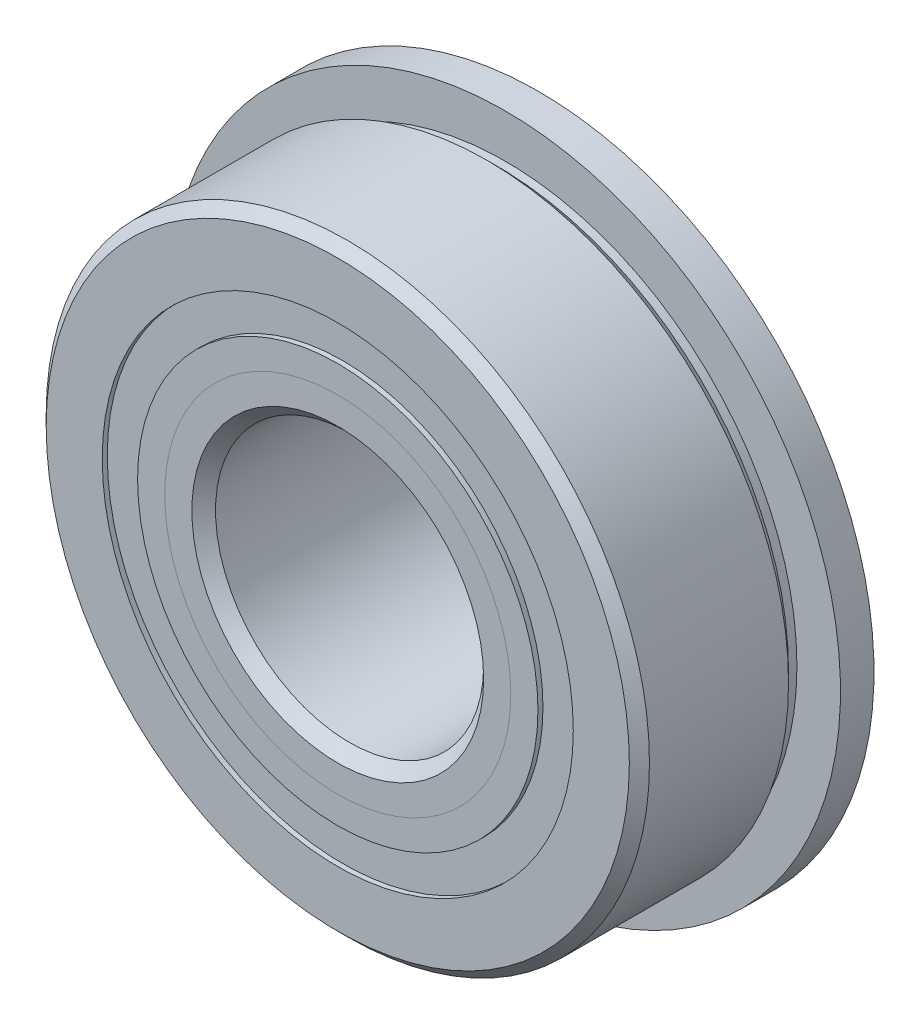
ISO-10303-21;
HEADER;
FILE_DESCRIPTION(('STEP AP214'),'2;1');
FILE_NAME('part.step','',(''),(''),'','','');
FILE_SCHEMA(('AUTOMOTIVE_DESIGN { 1 0 10303 214 1 1 1 1 }'));
ENDSEC;
DATA;
#1=APPLICATION_CONTEXT('core data for automotive mechanical design processes');
#2=APPLICATION_PROTOCOL_DEFINITION('international standard','automotive_design',2000,#1);
#3=PRODUCT_CONTEXT('',#1,'mechanical');
#4=PRODUCT('Part','Part','',(#3));
#5=PRODUCT_RELATED_PRODUCT_CATEGORY('part','',(#4));
#6=PRODUCT_DEFINITION_FORMATION('','',#4);
#7=PRODUCT_DEFINITION_CONTEXT('part definition',#1,'design');
#8=PRODUCT_DEFINITION('design','',#6,#7);
#9=PRODUCT_DEFINITION_SHAPE('','',#8);
#10=(LENGTH_UNIT() NAMED_UNIT(*) SI_UNIT(.MILLI.,.METRE.));
#11=(NAMED_UNIT(*) PLANE_ANGLE_UNIT() SI_UNIT($,.RADIAN.));
#12=(NAMED_UNIT(*) SI_UNIT($,.STERADIAN.) SOLID_ANGLE_UNIT());
#13=UNCERTAINTY_MEASURE_WITH_UNIT(LENGTH_MEASURE(1.E-05),#10,'distance_accuracy_value','');
#14=(GEOMETRIC_REPRESENTATION_CONTEXT(3) GLOBAL_UNCERTAINTY_ASSIGNED_CONTEXT((#13)) GLOBAL_UNIT_ASSIGNED_CONTEXT((#10,
#11,#12)) REPRESENTATION_CONTEXT('',''));
#15=CARTESIAN_POINT('',(0.,0.,0.));
#16=DIRECTION('',(0.,0.,1.));
#17=DIRECTION('',(1.,0.,0.));
#18=AXIS2_PLACEMENT_3D('',#15,#16,#17);
#19=CARTESIAN_POINT('',(0.,11.1561126373626,-4.524375));
#20=DIRECTION('',(0.,0.,1.));
#21=DIRECTION('',(1.,0.,0.));
#22=AXIS2_PLACEMENT_3D('',#19,#20,#21);
#23=PLANE('',#22);
#24=CARTESIAN_POINT('',(0.,0.,-4.524375));
#25=DIRECTION('',(0.,0.,1.));
#26=DIRECTION('',(1.,0.,0.));
#27=AXIS2_PLACEMENT_3D('',#24,#25,#26);
#28=CIRCLE('',#27,11.1561126373626);
#29=CARTESIAN_POINT('',(11.1561126373626,0.,-4.524375));
#30=VERTEX_POINT('',#29);
#31=EDGE_CURVE('E62',#30,#30,#28,.T.);
#32=ORIENTED_EDGE('',*,*,#31,.F.);
#33=EDGE_LOOP('',(#32));
#34=FACE_BOUND('',#33,.T.);
#35=CARTESIAN_POINT('',(0.,0.,-4.524375));
#36=DIRECTION('',(0.,0.,1.));
#37=DIRECTION('',(1.,0.,0.));
#38=AXIS2_PLACEMENT_3D('',#35,#36,#37);
#39=CIRCLE('',#38,8.7376);
#40=CARTESIAN_POINT('',(8.7376,0.,-4.524375));
#41=VERTEX_POINT('',#40);
#42=EDGE_CURVE('E11',#41,#41,#39,.T.);
#43=ORIENTED_EDGE('',*,*,#42,.T.);
#44=EDGE_LOOP('',(#43));
#45=FACE_BOUND('',#44,.T.);
#46=ADVANCED_FACE('F48',(#34,#45),#23,.F.);
#47=CARTESIAN_POINT('',(0.,0.,4.7625));
#48=DIRECTION('',(0.,0.,1.));
#49=DIRECTION('',(1.,0.,0.));
#50=AXIS2_PLACEMENT_3D('',#47,#48,#49);
#51=CYLINDRICAL_SURFACE('',#50,8.7376);
#52=ORIENTED_EDGE('',*,*,#42,.F.);
#53=EDGE_LOOP('',(#52));
#54=FACE_BOUND('',#53,.T.);
#55=CARTESIAN_POINT('',(0.,0.,-2.84734080430121));
#56=DIRECTION('',(0.,0.,1.));
#57=DIRECTION('',(1.,0.,0.));
#58=AXIS2_PLACEMENT_3D('',#55,#56,#57);
#59=CIRCLE('',#58,8.7376);
#60=CARTESIAN_POINT('',(8.7376,0.,-2.84734080430121));
#61=VERTEX_POINT('',#60);
#62=EDGE_CURVE('E54',#61,#61,#59,.T.);
#63=ORIENTED_EDGE('',*,*,#62,.T.);
#64=EDGE_LOOP('',(#63));
#65=FACE_BOUND('',#64,.T.);
#66=ADVANCED_FACE('F71',(#54,#65),#51,.F.);
#67=CARTESIAN_POINT('',(0.,11.1561126373626,-2.84734080430121));
#68=DIRECTION('',(0.,0.,-1.));
#69=DIRECTION('',(-1.,0.,0.));
#70=AXIS2_PLACEMENT_3D('',#67,#68,#69);
#71=PLANE('',#70);
#72=ORIENTED_EDGE('',*,*,#62,.F.);
#73=EDGE_LOOP('',(#72));
#74=FACE_BOUND('',#73,.T.);
#75=CARTESIAN_POINT('',(0.,0.,-2.84734080430121));
#76=DIRECTION('',(0.,0.,1.));
#77=DIRECTION('',(1.,0.,0.));
#78=AXIS2_PLACEMENT_3D('',#75,#76,#77);
#79=CIRCLE('',#78,11.1561126373626);
#80=CARTESIAN_POINT('',(11.1561126373626,0.,-2.84734080430121));
#81=VERTEX_POINT('',#80);
#82=EDGE_CURVE('E58',#81,#81,#79,.T.);
#83=ORIENTED_EDGE('',*,*,#82,.T.);
#84=EDGE_LOOP('',(#83));
#85=FACE_BOUND('',#84,.T.);
#86=ADVANCED_FACE('F75',(#74,#85),#71,.F.);
#87=CARTESIAN_POINT('',(0.,0.,4.7625));
#88=DIRECTION('',(0.,0.,1.));
#89=DIRECTION('',(1.,0.,0.));
#90=AXIS2_PLACEMENT_3D('',#87,#88,#89);
#91=CYLINDRICAL_SURFACE('',#90,11.1561126373626);
#92=ORIENTED_EDGE('',*,*,#82,.F.);
#93=EDGE_LOOP('',(#92));
#94=FACE_BOUND('',#93,.T.);
#95=ORIENTED_EDGE('',*,*,#31,.T.);
#96=EDGE_LOOP('',(#95));
#97=FACE_BOUND('',#96,.T.);
#98=ADVANCED_FACE('F68',(#94,#97),#91,.T.);
#99=CLOSED_SHELL('',(#46,#66,#86,#98));
#100=MANIFOLD_SOLID_BREP('B2',#99);
#101=CARTESIAN_POINT('',(0.,11.1561126373626,4.524375));
#102=DIRECTION('',(0.,0.,-1.));
#103=DIRECTION('',(-1.,0.,0.));
#104=AXIS2_PLACEMENT_3D('',#101,#102,#103);
#105=PLANE('',#104);
#106=CARTESIAN_POINT('',(0.,0.,4.524375));
#107=DIRECTION('',(0.,0.,1.));
#108=DIRECTION('',(1.,0.,0.));
#109=AXIS2_PLACEMENT_3D('',#106,#107,#108);
#110=CIRCLE('',#109,9.48138736263736);
#111=CARTESIAN_POINT('',(9.48138736263736,0.,4.524375));
#112=VERTEX_POINT('',#111);
#113=EDGE_CURVE('E47',#112,#112,#110,.T.);
#114=ORIENTED_EDGE('',*,*,#113,.F.);
#115=EDGE_LOOP('',(#114));
#116=FACE_BOUND('',#115,.T.);
#117=CARTESIAN_POINT('',(0.,0.,4.524375));
#118=DIRECTION('',(0.,0.,1.));
#119=DIRECTION('',(1.,0.,0.));
#120=AXIS2_PLACEMENT_3D('',#117,#118,#119);
#121=CIRCLE('',#120,11.1561126373626);
#122=CARTESIAN_POINT('',(11.1561126373626,0.,4.524375));
#123=VERTEX_POINT('',#122);
#124=EDGE_CURVE('E122',#123,#123,#121,.T.);
#125=ORIENTED_EDGE('',*,*,#124,.T.);
#126=EDGE_LOOP('',(#125));
#127=FACE_BOUND('',#126,.T.);
#128=ADVANCED_FACE('F108',(#116,#127),#105,.F.);
#129=CARTESIAN_POINT('',(0.,0.,4.7625));
#130=DIRECTION('',(0.,0.,1.));
#131=DIRECTION('',(1.,0.,0.));
#132=AXIS2_PLACEMENT_3D('',#129,#130,#131);
#133=CYLINDRICAL_SURFACE('',#132,9.48138736263736);
#134=CARTESIAN_POINT('',(0.,0.,2.84734080430121));
#135=DIRECTION('',(0.,0.,1.));
#136=DIRECTION('',(1.,0.,0.));
#137=AXIS2_PLACEMENT_3D('',#134,#135,#136);
#138=CIRCLE('',#137,9.48138736263736);
#139=CARTESIAN_POINT('',(9.48138736263736,0.,2.84734080430121));
#140=VERTEX_POINT('',#139);
#141=EDGE_CURVE('E114',#140,#140,#138,.T.);
#142=ORIENTED_EDGE('',*,*,#141,.F.);
#143=EDGE_LOOP('',(#142));
#144=FACE_BOUND('',#143,.T.);
#145=ORIENTED_EDGE('',*,*,#113,.T.);
#146=EDGE_LOOP('',(#145));
#147=FACE_BOUND('',#146,.T.);
#148=ADVANCED_FACE('F137',(#144,#147),#133,.F.);
#149=CARTESIAN_POINT('',(0.,11.1561126373626,2.84734080430121));
#150=DIRECTION('',(0.,0.,1.));
#151=DIRECTION('',(1.,0.,0.));
#152=AXIS2_PLACEMENT_3D('',#149,#150,#151);
#153=PLANE('',#152);
#154=CARTESIAN_POINT('',(0.,0.,2.84734080430121));
#155=DIRECTION('',(0.,0.,1.));
#156=DIRECTION('',(1.,0.,0.));
#157=AXIS2_PLACEMENT_3D('',#154,#155,#156);
#158=CIRCLE('',#157,11.1561126373626);
#159=CARTESIAN_POINT('',(11.1561126373626,0.,2.84734080430121));
#160=VERTEX_POINT('',#159);
#161=EDGE_CURVE('E118',#160,#160,#158,.T.);
#162=ORIENTED_EDGE('',*,*,#161,.F.);
#163=EDGE_LOOP('',(#162));
#164=FACE_BOUND('',#163,.T.);
#165=ORIENTED_EDGE('',*,*,#141,.T.);
#166=EDGE_LOOP('',(#165));
#167=FACE_BOUND('',#166,.T.);
#168=ADVANCED_FACE('F132',(#164,#167),#153,.F.);
#169=CARTESIAN_POINT('',(0.,0.,4.7625));
#170=DIRECTION('',(0.,0.,1.));
#171=DIRECTION('',(1.,0.,0.));
#172=AXIS2_PLACEMENT_3D('',#169,#170,#171);
#173=CYLINDRICAL_SURFACE('',#172,11.1561126373626);
#174=ORIENTED_EDGE('',*,*,#124,.F.);
#175=EDGE_LOOP('',(#174));
#176=FACE_BOUND('',#175,.T.);
#177=ORIENTED_EDGE('',*,*,#161,.T.);
#178=EDGE_LOOP('',(#177));
#179=FACE_BOUND('',#178,.T.);
#180=ADVANCED_FACE('F129',(#176,#179),#173,.T.);
#181=CLOSED_SHELL('',(#128,#148,#168,#180));
#182=MANIFOLD_SOLID_BREP('B6',#181);
#183=CARTESIAN_POINT('',(-5.15937499999989,8.93629963530074,0.));
#184=DIRECTION('',(0.,0.,1.));
#185=DIRECTION('',(-0.499999999999989,0.866025403784445,0.));
#186=AXIS2_PLACEMENT_3D('',#183,#184,#185);
#187=SPHERICAL_SURFACE('',#186,2.84734080430121);
#188=CARTESIAN_POINT('',(-5.15937499999989,8.93629963530074,2.84734080430121));
#189=VERTEX_POINT('',#188);
#190=VERTEX_LOOP('',#189);
#191=FACE_BOUND('',#190,.T.);
#192=ADVANCED_FACE('F168',(#191),#187,.T.);
#193=CLOSED_SHELL('',(#192));
#194=MANIFOLD_SOLID_BREP('B42',#193);
#195=CARTESIAN_POINT('',(-8.93629963530062,5.1593750000001,0.));
#196=DIRECTION('',(0.,0.,1.));
#197=DIRECTION('',(-0.866025403784433,0.50000000000001,0.));
#198=AXIS2_PLACEMENT_3D('',#195,#196,#197);
#199=SPHERICAL_SURFACE('',#198,2.84734080430121);
#200=CARTESIAN_POINT('',(-8.93629963530062,5.1593750000001,2.84734080430121));
#201=VERTEX_POINT('',#200);
#202=VERTEX_LOOP('',#201);
#203=FACE_BOUND('',#202,.T.);
#204=ADVANCED_FACE('F205',(#203),#199,.T.);
#205=CLOSED_SHELL('',(#204));
#206=MANIFOLD_SOLID_BREP('B104',#205);
#207=CARTESIAN_POINT('',(-10.31875,1.08083169195563E-13,0.));
#208=DIRECTION('',(0.,0.,1.));
#209=DIRECTION('',(-1.,0.,0.));
#210=AXIS2_PLACEMENT_3D('',#207,#208,#209);
#211=SPHERICAL_SURFACE('',#210,2.84734080430121);
#212=CARTESIAN_POINT('',(-10.31875,1.08083169195563E-13,2.84734080430121));
#213=VERTEX_POINT('',#212);
#214=VERTEX_LOOP('',#213);
#215=FACE_BOUND('',#214,.T.);
#216=ADVANCED_FACE('F240',(#215),#211,.T.);
#217=CLOSED_SHELL('',(#216));
#218=MANIFOLD_SOLID_BREP('B164',#217);
#219=CARTESIAN_POINT('',(-8.93629963530072,-5.15937499999992,0.));
#220=DIRECTION('',(0.,0.,1.));
#221=DIRECTION('',(-0.866025403784443,-0.499999999999992,0.));
#222=AXIS2_PLACEMENT_3D('',#219,#220,#221);
#223=SPHERICAL_SURFACE('',#222,2.84734080430121);
#224=CARTESIAN_POINT('',(-8.93629963530072,-5.15937499999992,2.84734080430121));
#225=VERTEX_POINT('',#224);
#226=VERTEX_LOOP('',#225);
#227=FACE_BOUND('',#226,.T.);
#228=ADVANCED_FACE('F275',(#227),#223,.T.);
#229=CLOSED_SHELL('',(#228));
#230=MANIFOLD_SOLID_BREP('B201',#229);
#231=CARTESIAN_POINT('',(-5.15937500000007,-8.93629963530064,0.));
#232=DIRECTION('',(0.,0.,1.));
#233=DIRECTION('',(-0.500000000000007,-0.866025403784435,0.));
#234=AXIS2_PLACEMENT_3D('',#231,#232,#233);
#235=SPHERICAL_SURFACE('',#234,2.84734080430121);
#236=CARTESIAN_POINT('',(-5.15937500000007,-8.93629963530064,2.84734080430121));
#237=VERTEX_POINT('',#236);
#238=VERTEX_LOOP('',#237);
#239=FACE_BOUND('',#238,.T.);
#240=ADVANCED_FACE('F310',(#239),#235,.T.);
#241=CLOSED_SHELL('',(#240));
#242=MANIFOLD_SOLID_BREP('B236',#241);
#243=CARTESIAN_POINT('',(0.,-10.31875,0.));
#244=DIRECTION('',(0.,0.,1.));
#245=DIRECTION('',(0.,-1.,0.));
#246=AXIS2_PLACEMENT_3D('',#243,#244,#245);
#247=SPHERICAL_SURFACE('',#246,2.84734080430121);
#248=CARTESIAN_POINT('',(0.,-10.31875,2.84734080430121));
#249=VERTEX_POINT('',#248);
#250=VERTEX_LOOP('',#249);
#251=FACE_BOUND('',#250,.T.);
#252=ADVANCED_FACE('F347',(#251),#247,.T.);
#253=CLOSED_SHELL('',(#252));
#254=MANIFOLD_SOLID_BREP('B271',#253);
#255=CARTESIAN_POINT('',(5.15937499999995,-8.93629963530071,0.));
#256=DIRECTION('',(0.,0.,1.));
#257=DIRECTION('',(0.499999999999995,-0.866025403784442,0.));
#258=AXIS2_PLACEMENT_3D('',#255,#256,#257);
#259=SPHERICAL_SURFACE('',#258,2.84734080430121);
#260=CARTESIAN_POINT('',(5.15937499999995,-8.93629963530071,2.84734080430121));
#261=VERTEX_POINT('',#260);
#262=VERTEX_LOOP('',#261);
#263=FACE_BOUND('',#262,.T.);
#264=ADVANCED_FACE('F384',(#263),#259,.T.);
#265=CLOSED_SHELL('',(#264));
#266=MANIFOLD_SOLID_BREP('B306',#265);
#267=CARTESIAN_POINT('',(8.93629963530065,-5.15937500000004,0.));
#268=DIRECTION('',(0.,0.,1.));
#269=DIRECTION('',(0.866025403784436,-0.500000000000004,0.));
#270=AXIS2_PLACEMENT_3D('',#267,#268,#269);
#271=SPHERICAL_SURFACE('',#270,2.84734080430121);
#272=CARTESIAN_POINT('',(8.93629963530065,-5.15937500000004,2.84734080430121));
#273=VERTEX_POINT('',#272);
#274=VERTEX_LOOP('',#273);
#275=FACE_BOUND('',#274,.T.);
#276=ADVANCED_FACE('F421',(#275),#271,.T.);
#277=CLOSED_SHELL('',(#276));
#278=MANIFOLD_SOLID_BREP('B343',#277);
#279=CARTESIAN_POINT('',(10.31875,0.,0.));
#280=DIRECTION('',(0.,0.,1.));
#281=DIRECTION('',(1.,0.,0.));
#282=AXIS2_PLACEMENT_3D('',#279,#280,#281);
#283=SPHERICAL_SURFACE('',#282,2.84734080430121);
#284=CARTESIAN_POINT('',(10.31875,0.,2.84734080430121));
#285=VERTEX_POINT('',#284);
#286=VERTEX_LOOP('',#285);
#287=FACE_BOUND('',#286,.T.);
#288=ADVANCED_FACE('F458',(#287),#283,.T.);
#289=CLOSED_SHELL('',(#288));
#290=MANIFOLD_SOLID_BREP('B380',#289);
#291=CARTESIAN_POINT('',(8.93629963530069,5.15937499999998,0.));
#292=DIRECTION('',(0.,0.,1.));
#293=DIRECTION('',(0.86602540378444,0.499999999999998,0.));
#294=AXIS2_PLACEMENT_3D('',#291,#292,#293);
#295=SPHERICAL_SURFACE('',#294,2.84734080430121);
#296=CARTESIAN_POINT('',(8.93629963530069,5.15937499999998,2.84734080430121));
#297=VERTEX_POINT('',#296);
#298=VERTEX_LOOP('',#297);
#299=FACE_BOUND('',#298,.T.);
#300=ADVANCED_FACE('F495',(#299),#295,.T.);
#301=CLOSED_SHELL('',(#300));
#302=MANIFOLD_SOLID_BREP('B417',#301);
#303=CARTESIAN_POINT('',(5.15937500000001,8.93629963530067,0.));
#304=DIRECTION('',(0.,0.,1.));
#305=DIRECTION('',(0.500000000000001,0.866025403784438,0.));
#306=AXIS2_PLACEMENT_3D('',#303,#304,#305);
#307=SPHERICAL_SURFACE('',#306,2.84734080430121);
#308=CARTESIAN_POINT('',(5.15937500000001,8.93629963530067,2.84734080430121));
#309=VERTEX_POINT('',#308);
#310=VERTEX_LOOP('',#309);
#311=FACE_BOUND('',#310,.T.);
#312=ADVANCED_FACE('F532',(#311),#307,.T.);
#313=CLOSED_SHELL('',(#312));
#314=MANIFOLD_SOLID_BREP('B454',#313);
#315=CARTESIAN_POINT('',(0.,10.31875,0.));
#316=DIRECTION('',(0.,0.,1.));
#317=DIRECTION('',(0.,1.,0.));
#318=AXIS2_PLACEMENT_3D('',#315,#316,#317);
#319=SPHERICAL_SURFACE('',#318,2.84734080430121);
#320=CARTESIAN_POINT('',(0.,10.31875,2.84734080430121));
#321=VERTEX_POINT('',#320);
#322=VERTEX_LOOP('',#321);
#323=FACE_BOUND('',#322,.T.);
#324=ADVANCED_FACE('F571',(#323),#319,.T.);
#325=CLOSED_SHELL('',(#324));
#326=MANIFOLD_SOLID_BREP('B491',#325);
#327=CARTESIAN_POINT('',(0.,8.19604598024338,4.7625));
#328=DIRECTION('',(0.,0.,-1.));
#329=DIRECTION('',(-1.,0.,0.));
#330=AXIS2_PLACEMENT_3D('',#327,#328,#329);
#331=PLANE('',#330);
#332=CARTESIAN_POINT('',(0.,0.,4.7625));
#333=DIRECTION('',(0.,0.,1.));
#334=DIRECTION('',(1.,0.,0.));
#335=AXIS2_PLACEMENT_3D('',#332,#333,#334);
#336=CIRCLE('',#335,6.91070459784939);
#337=CARTESIAN_POINT('',(6.91070459784939,0.,4.7625));
#338=VERTEX_POINT('',#337);
#339=EDGE_CURVE('E624',#338,#338,#336,.T.);
#340=ORIENTED_EDGE('',*,*,#339,.F.);
#341=EDGE_LOOP('',(#340));
#342=FACE_BOUND('',#341,.T.);
#343=CARTESIAN_POINT('',(0.,0.,4.7625));
#344=DIRECTION('',(0.,0.,1.));
#345=DIRECTION('',(1.,0.,0.));
#346=AXIS2_PLACEMENT_3D('',#343,#344,#345);
#347=CIRCLE('',#346,8.19604598024338);
#348=CARTESIAN_POINT('',(8.19604598024338,0.,4.7625));
#349=VERTEX_POINT('',#348);
#350=EDGE_CURVE('E570',#349,#349,#347,.T.);
#351=ORIENTED_EDGE('',*,*,#350,.T.);
#352=EDGE_LOOP('',(#351));
#353=FACE_BOUND('',#352,.T.);
#354=ADVANCED_FACE('F590',(#342,#353),#331,.F.);
#355=CARTESIAN_POINT('',(0.,0.,3.47715861760602));
#356=DIRECTION('',(0.,0.,1.));
#357=DIRECTION('',(1.,0.,0.));
#358=AXIS2_PLACEMENT_3D('',#355,#356,#357);
#359=CONICAL_SURFACE('',#358,6.91070459784939,0.78539816339745);
#360=ORIENTED_EDGE('',*,*,#350,.F.);
#361=EDGE_LOOP('',(#360));
#362=FACE_BOUND('',#361,.T.);
#363=CARTESIAN_POINT('',(0.,0.,3.47715861760602));
#364=DIRECTION('',(0.,0.,1.));
#365=DIRECTION('',(1.,0.,0.));
#366=AXIS2_PLACEMENT_3D('',#363,#364,#365);
#367=CIRCLE('',#366,6.91070459784939);
#368=CARTESIAN_POINT('',(6.91070459784939,0.,3.47715861760602));
#369=VERTEX_POINT('',#368);
#370=EDGE_CURVE('E596',#369,#369,#367,.T.);
#371=ORIENTED_EDGE('',*,*,#370,.T.);
#372=EDGE_LOOP('',(#371));
#373=FACE_BOUND('',#372,.T.);
#374=ADVANCED_FACE('F631',(#362,#373),#359,.T.);
#375=CARTESIAN_POINT('',(0.,0.,4.7625));
#376=DIRECTION('',(0.,0.,1.));
#377=DIRECTION('',(1.,0.,0.));
#378=AXIS2_PLACEMENT_3D('',#375,#376,#377);
#379=CYLINDRICAL_SURFACE('',#378,6.91070459784939);
#380=ORIENTED_EDGE('',*,*,#370,.F.);
#381=EDGE_LOOP('',(#380));
#382=FACE_BOUND('',#381,.T.);
#383=CARTESIAN_POINT('',(0.,0.,0.));
#384=DIRECTION('',(0.,0.,1.));
#385=DIRECTION('',(1.,0.,0.));
#386=AXIS2_PLACEMENT_3D('',#383,#384,#385);
#387=CIRCLE('',#386,6.91070459784939);
#388=CARTESIAN_POINT('',(6.91070459784939,0.,0.));
#389=VERTEX_POINT('',#388);
#390=EDGE_CURVE('E600',#389,#389,#387,.T.);
#391=ORIENTED_EDGE('',*,*,#390,.T.);
#392=EDGE_LOOP('',(#391));
#393=FACE_BOUND('',#392,.T.);
#394=ADVANCED_FACE('F635',(#382,#393),#379,.T.);
#395=CARTESIAN_POINT('',(0.,6.91070459784939,0.));
#396=DIRECTION('',(0.,0.,-1.));
#397=DIRECTION('',(-1.,0.,0.));
#398=AXIS2_PLACEMENT_3D('',#395,#396,#397);
#399=PLANE('',#398);
#400=ORIENTED_EDGE('',*,*,#390,.F.);
#401=EDGE_LOOP('',(#400));
#402=FACE_BOUND('',#401,.T.);
#403=CARTESIAN_POINT('',(0.,0.,0.));
#404=DIRECTION('',(0.,0.,1.));
#405=DIRECTION('',(1.,0.,0.));
#406=AXIS2_PLACEMENT_3D('',#403,#404,#405);
#407=CIRCLE('',#406,7.47140919569879);
#408=CARTESIAN_POINT('',(7.47140919569879,0.,0.));
#409=VERTEX_POINT('',#408);
#410=EDGE_CURVE('E604',#409,#409,#407,.T.);
#411=ORIENTED_EDGE('',*,*,#410,.T.);
#412=EDGE_LOOP('',(#411));
#413=FACE_BOUND('',#412,.T.);
#414=ADVANCED_FACE('F640',(#402,#413),#399,.F.);
#415=CARTESIAN_POINT('',(0.,0.,0.));
#416=DIRECTION('',(0.,0.,1.));
#417=DIRECTION('',(1.,0.,0.));
#418=AXIS2_PLACEMENT_3D('',#415,#416,#417);
#419=TOROIDAL_SURFACE('',#418,10.31875,2.84734080430121);
#420=ORIENTED_EDGE('',*,*,#410,.F.);
#421=EDGE_LOOP('',(#420));
#422=FACE_BOUND('',#421,.T.);
#423=CARTESIAN_POINT('',(0.,0.,-2.36797684391944));
#424=DIRECTION('',(0.,0.,1.));
#425=DIRECTION('',(1.,0.,0.));
#426=AXIS2_PLACEMENT_3D('',#423,#424,#425);
#427=CIRCLE('',#426,8.7376);
#428=CARTESIAN_POINT('',(8.7376,0.,-2.36797684391944));
#429=VERTEX_POINT('',#428);
#430=EDGE_CURVE('E609',#429,#429,#427,.T.);
#431=ORIENTED_EDGE('',*,*,#430,.T.);
#432=EDGE_LOOP('',(#431));
#433=FACE_BOUND('',#432,.T.);
#434=ADVANCED_FACE('F646',(#422,#433),#419,.F.);
#435=CARTESIAN_POINT('',(0.,0.,4.7625));
#436=DIRECTION('',(0.,0.,1.));
#437=DIRECTION('',(1.,0.,0.));
#438=AXIS2_PLACEMENT_3D('',#435,#436,#437);
#439=CYLINDRICAL_SURFACE('',#438,8.7376);
#440=ORIENTED_EDGE('',*,*,#430,.F.);
#441=EDGE_LOOP('',(#440));
#442=FACE_BOUND('',#441,.T.);
#443=CARTESIAN_POINT('',(0.,0.,-6.35));
#444=DIRECTION('',(0.,0.,1.));
#445=DIRECTION('',(1.,0.,0.));
#446=AXIS2_PLACEMENT_3D('',#443,#444,#445);
#447=CIRCLE('',#446,8.7376);
#448=CARTESIAN_POINT('',(8.7376,0.,-6.35));
#449=VERTEX_POINT('',#448);
#450=EDGE_CURVE('E612',#449,#449,#447,.T.);
#451=ORIENTED_EDGE('',*,*,#450,.T.);
#452=EDGE_LOOP('',(#451));
#453=FACE_BOUND('',#452,.T.);
#454=ADVANCED_FACE('F650',(#442,#453),#439,.T.);
#455=CARTESIAN_POINT('',(0.,6.82625,-6.35));
#456=DIRECTION('',(0.,0.,1.));
#457=DIRECTION('',(1.,0.,0.));
#458=AXIS2_PLACEMENT_3D('',#455,#456,#457);
#459=PLANE('',#458);
#460=ORIENTED_EDGE('',*,*,#450,.F.);
#461=EDGE_LOOP('',(#460));
#462=FACE_BOUND('',#461,.T.);
#463=CARTESIAN_POINT('',(0.,0.,-6.35));
#464=DIRECTION('',(0.,0.,1.));
#465=DIRECTION('',(1.,0.,0.));
#466=AXIS2_PLACEMENT_3D('',#463,#464,#465);
#467=CIRCLE('',#466,6.82625);
#468=CARTESIAN_POINT('',(6.82625,0.,-6.35));
#469=VERTEX_POINT('',#468);
#470=EDGE_CURVE('E615',#469,#469,#467,.T.);
#471=ORIENTED_EDGE('',*,*,#470,.T.);
#472=EDGE_LOOP('',(#471));
#473=FACE_BOUND('',#472,.T.);
#474=ADVANCED_FACE('F654',(#462,#473),#459,.F.);
#475=CARTESIAN_POINT('',(0.,0.,-5.87375));
#476=DIRECTION('',(0.,0.,-1.));
#477=DIRECTION('',(-1.,0.,0.));
#478=AXIS2_PLACEMENT_3D('',#475,#476,#477);
#479=CONICAL_SURFACE('',#478,6.35,0.785398163397445);
#480=ORIENTED_EDGE('',*,*,#470,.F.);
#481=EDGE_LOOP('',(#480));
#482=FACE_BOUND('',#481,.T.);
#483=CARTESIAN_POINT('',(0.,0.,-5.87375));
#484=DIRECTION('',(0.,0.,1.));
#485=DIRECTION('',(1.,0.,0.));
#486=AXIS2_PLACEMENT_3D('',#483,#484,#485);
#487=CIRCLE('',#486,6.35);
#488=CARTESIAN_POINT('',(6.35,0.,-5.87375));
#489=VERTEX_POINT('',#488);
#490=EDGE_CURVE('E618',#489,#489,#487,.T.);
#491=ORIENTED_EDGE('',*,*,#490,.T.);
#492=EDGE_LOOP('',(#491));
#493=FACE_BOUND('',#492,.T.);
#494=ADVANCED_FACE('F658',(#482,#493),#479,.F.);
#495=CARTESIAN_POINT('',(0.,0.,4.7625));
#496=DIRECTION('',(0.,0.,1.));
#497=DIRECTION('',(1.,0.,0.));
#498=AXIS2_PLACEMENT_3D('',#495,#496,#497);
#499=CYLINDRICAL_SURFACE('',#498,6.35);
#500=ORIENTED_EDGE('',*,*,#490,.F.);
#501=EDGE_LOOP('',(#500));
#502=FACE_BOUND('',#501,.T.);
#503=CARTESIAN_POINT('',(0.,0.,4.20179540215061));
#504=DIRECTION('',(0.,0.,1.));
#505=DIRECTION('',(1.,0.,0.));
#506=AXIS2_PLACEMENT_3D('',#503,#504,#505);
#507=CIRCLE('',#506,6.35);
#508=CARTESIAN_POINT('',(6.35,0.,4.20179540215061));
#509=VERTEX_POINT('',#508);
#510=EDGE_CURVE('E621',#509,#509,#507,.T.);
#511=ORIENTED_EDGE('',*,*,#510,.T.);
#512=EDGE_LOOP('',(#511));
#513=FACE_BOUND('',#512,.T.);
#514=ADVANCED_FACE('F662',(#502,#513),#499,.F.);
#515=CARTESIAN_POINT('',(0.,0.,4.7625));
#516=DIRECTION('',(0.,0.,1.));
#517=DIRECTION('',(1.,0.,0.));
#518=AXIS2_PLACEMENT_3D('',#515,#516,#517);
#519=CONICAL_SURFACE('',#518,6.91070459784939,0.785398163397451);
#520=ORIENTED_EDGE('',*,*,#510,.F.);
#521=EDGE_LOOP('',(#520));
#522=FACE_BOUND('',#521,.T.);
#523=ORIENTED_EDGE('',*,*,#339,.T.);
#524=EDGE_LOOP('',(#523));
#525=FACE_BOUND('',#524,.T.);
#526=ADVANCED_FACE('F628',(#522,#525),#519,.F.);
#527=CLOSED_SHELL('',(#354,#374,#394,#414,#434,#454,#474,#494,#514,#526));
#528=MANIFOLD_SOLID_BREP('B528',#527);
#529=CARTESIAN_POINT('',(0.,9.48138736263736,4.7625));
#530=DIRECTION('',(0.,0.,-1.));
#531=DIRECTION('',(-1.,0.,0.));
#532=AXIS2_PLACEMENT_3D('',#529,#530,#531);
#533=PLANE('',#532);
#534=CARTESIAN_POINT('',(0.,0.,4.7625));
#535=DIRECTION('',(0.,0.,1.));
#536=DIRECTION('',(1.,0.,0.));
#537=AXIS2_PLACEMENT_3D('',#534,#535,#536);
#538=CIRCLE('',#537,8.19604598024338);
#539=CARTESIAN_POINT('',(8.19604598024338,0.,4.7625));
#540=VERTEX_POINT('',#539);
#541=EDGE_CURVE('E589',#540,#540,#538,.T.);
#542=ORIENTED_EDGE('',*,*,#541,.F.);
#543=EDGE_LOOP('',(#542));
#544=FACE_BOUND('',#543,.T.);
#545=CARTESIAN_POINT('',(0.,0.,4.7625));
#546=DIRECTION('',(0.,0.,1.));
#547=DIRECTION('',(1.,0.,0.));
#548=AXIS2_PLACEMENT_3D('',#545,#546,#547);
#549=CIRCLE('',#548,9.48138736263736);
#550=CARTESIAN_POINT('',(9.48138736263736,0.,4.7625));
#551=VERTEX_POINT('',#550);
#552=EDGE_CURVE('E751',#551,#551,#549,.T.);
#553=ORIENTED_EDGE('',*,*,#552,.T.);
#554=EDGE_LOOP('',(#553));
#555=FACE_BOUND('',#554,.T.);
#556=ADVANCED_FACE('F729',(#544,#555),#533,.F.);
#557=CARTESIAN_POINT('',(0.,0.,4.7625));
#558=DIRECTION('',(0.,0.,1.));
#559=DIRECTION('',(1.,0.,0.));
#560=AXIS2_PLACEMENT_3D('',#557,#558,#559);
#561=CONICAL_SURFACE('',#560,8.19604598024338,0.78539816339745);
#562=CARTESIAN_POINT('',(0.,0.,3.47715861760602));
#563=DIRECTION('',(0.,0.,1.));
#564=DIRECTION('',(1.,0.,0.));
#565=AXIS2_PLACEMENT_3D('',#562,#563,#564);
#566=CIRCLE('',#565,6.91070459784939);
#567=CARTESIAN_POINT('',(6.91070459784939,0.,3.47715861760602));
#568=VERTEX_POINT('',#567);
#569=EDGE_CURVE('E735',#568,#568,#566,.T.);
#570=ORIENTED_EDGE('',*,*,#569,.F.);
#571=EDGE_LOOP('',(#570));
#572=FACE_BOUND('',#571,.T.);
#573=ORIENTED_EDGE('',*,*,#541,.T.);
#574=EDGE_LOOP('',(#573));
#575=FACE_BOUND('',#574,.T.);
#576=ADVANCED_FACE('F776',(#572,#575),#561,.F.);
#577=CARTESIAN_POINT('',(0.,0.,4.7625));
#578=DIRECTION('',(0.,0.,1.));
#579=DIRECTION('',(1.,0.,0.));
#580=AXIS2_PLACEMENT_3D('',#577,#578,#579);
#581=CYLINDRICAL_SURFACE('',#580,6.91070459784939);
#582=CARTESIAN_POINT('',(0.,0.,0.));
#583=DIRECTION('',(0.,0.,1.));
#584=DIRECTION('',(1.,0.,0.));
#585=AXIS2_PLACEMENT_3D('',#582,#583,#584);
#586=CIRCLE('',#585,6.91070459784939);
#587=CARTESIAN_POINT('',(6.91070459784939,0.,0.));
#588=VERTEX_POINT('',#587);
#589=EDGE_CURVE('E739',#588,#588,#586,.T.);
#590=ORIENTED_EDGE('',*,*,#589,.F.);
#591=EDGE_LOOP('',(#590));
#592=FACE_BOUND('',#591,.T.);
#593=ORIENTED_EDGE('',*,*,#569,.T.);
#594=EDGE_LOOP('',(#593));
#595=FACE_BOUND('',#594,.T.);
#596=ADVANCED_FACE('F771',(#592,#595),#581,.F.);
#597=CARTESIAN_POINT('',(0.,6.91070459784939,0.));
#598=DIRECTION('',(0.,0.,1.));
#599=DIRECTION('',(1.,0.,0.));
#600=AXIS2_PLACEMENT_3D('',#597,#598,#599);
#601=PLANE('',#600);
#602=CARTESIAN_POINT('',(0.,0.,0.));
#603=DIRECTION('',(0.,0.,1.));
#604=DIRECTION('',(1.,0.,0.));
#605=AXIS2_PLACEMENT_3D('',#602,#603,#604);
#606=CIRCLE('',#605,7.47140919569879);
#607=CARTESIAN_POINT('',(7.47140919569879,0.,0.));
#608=VERTEX_POINT('',#607);
#609=EDGE_CURVE('E743',#608,#608,#606,.T.);
#610=ORIENTED_EDGE('',*,*,#609,.F.);
#611=EDGE_LOOP('',(#610));
#612=FACE_BOUND('',#611,.T.);
#613=ORIENTED_EDGE('',*,*,#589,.T.);
#614=EDGE_LOOP('',(#613));
#615=FACE_BOUND('',#614,.T.);
#616=ADVANCED_FACE('F765',(#612,#615),#601,.F.);
#617=CARTESIAN_POINT('',(0.,0.,0.));
#618=DIRECTION('',(0.,0.,1.));
#619=DIRECTION('',(1.,0.,0.));
#620=AXIS2_PLACEMENT_3D('',#617,#618,#619);
#621=TOROIDAL_SURFACE('',#620,10.31875,2.84734080430121);
#622=CARTESIAN_POINT('',(0.,0.,2.72142857142857));
#623=DIRECTION('',(0.,0.,1.));
#624=DIRECTION('',(1.,0.,0.));
#625=AXIS2_PLACEMENT_3D('',#622,#623,#624);
#626=CIRCLE('',#625,9.48138736263736);
#627=CARTESIAN_POINT('',(9.48138736263736,0.,2.72142857142857));
#628=VERTEX_POINT('',#627);
#629=EDGE_CURVE('E748',#628,#628,#626,.T.);
#630=ORIENTED_EDGE('',*,*,#629,.F.);
#631=EDGE_LOOP('',(#630));
#632=FACE_BOUND('',#631,.T.);
#633=ORIENTED_EDGE('',*,*,#609,.T.);
#634=EDGE_LOOP('',(#633));
#635=FACE_BOUND('',#634,.T.);
#636=ADVANCED_FACE('F759',(#632,#635),#621,.F.);
#637=CARTESIAN_POINT('',(0.,0.,4.7625));
#638=DIRECTION('',(0.,0.,1.));
#639=DIRECTION('',(1.,0.,0.));
#640=AXIS2_PLACEMENT_3D('',#637,#638,#639);
#641=CYLINDRICAL_SURFACE('',#640,9.48138736263736);
#642=ORIENTED_EDGE('',*,*,#552,.F.);
#643=EDGE_LOOP('',(#642));
#644=FACE_BOUND('',#643,.T.);
#645=ORIENTED_EDGE('',*,*,#629,.T.);
#646=EDGE_LOOP('',(#645));
#647=FACE_BOUND('',#646,.T.);
#648=ADVANCED_FACE('F756',(#644,#647),#641,.T.);
#649=CLOSED_SHELL('',(#556,#576,#596,#616,#636,#648));
#650=MANIFOLD_SOLID_BREP('B565',#649);
#651=CARTESIAN_POINT('',(0.,0.,4.7625));
#652=DIRECTION('',(0.,0.,1.));
#653=DIRECTION('',(1.,0.,0.));
#654=AXIS2_PLACEMENT_3D('',#651,#652,#653);
#655=CYLINDRICAL_SURFACE('',#654,14.2875);
#656=CARTESIAN_POINT('',(0.,0.,4.28625));
#657=DIRECTION('',(0.,0.,1.));
#658=DIRECTION('',(1.,0.,0.));
#659=AXIS2_PLACEMENT_3D('',#656,#657,#658);
#660=CIRCLE('',#659,14.2875);
#661=CARTESIAN_POINT('',(14.2875,0.,4.28625));
#662=VERTEX_POINT('',#661);
#663=EDGE_CURVE('E728',#662,#662,#660,.T.);
#664=ORIENTED_EDGE('',*,*,#663,.F.);
#665=EDGE_LOOP('',(#664));
#666=FACE_BOUND('',#665,.T.);
#667=CARTESIAN_POINT('',(0.,0.,-2.30187500000001));
#668=DIRECTION('',(0.,0.,1.));
#669=DIRECTION('',(1.,0.,0.));
#670=AXIS2_PLACEMENT_3D('',#667,#668,#669);
#671=CIRCLE('',#670,14.2875);
#672=CARTESIAN_POINT('',(14.2875,0.,-2.30187500000001));
#673=VERTEX_POINT('',#672);
#674=EDGE_CURVE('E847',#673,#673,#671,.T.);
#675=ORIENTED_EDGE('',*,*,#674,.T.);
#676=EDGE_LOOP('',(#675));
#677=FACE_BOUND('',#676,.T.);
#678=ADVANCED_FACE('F809',(#666,#677),#655,.T.);
#679=CARTESIAN_POINT('',(0.,0.,4.28625));
#680=DIRECTION('',(0.,0.,-1.));
#681=DIRECTION('',(-1.,0.,0.));
#682=AXIS2_PLACEMENT_3D('',#679,#680,#681);
#683=CONICAL_SURFACE('',#682,14.2875,0.785398163397446);
#684=CARTESIAN_POINT('',(0.,0.,4.7625));
#685=DIRECTION('',(0.,0.,1.));
#686=DIRECTION('',(1.,0.,0.));
#687=AXIS2_PLACEMENT_3D('',#684,#685,#686);
#688=CIRCLE('',#687,13.81125);
#689=CARTESIAN_POINT('',(13.81125,0.,4.7625));
#690=VERTEX_POINT('',#689);
#691=EDGE_CURVE('E832',#690,#690,#688,.T.);
#692=ORIENTED_EDGE('',*,*,#691,.F.);
#693=EDGE_LOOP('',(#692));
#694=FACE_BOUND('',#693,.T.);
#695=ORIENTED_EDGE('',*,*,#663,.T.);
#696=EDGE_LOOP('',(#695));
#697=FACE_BOUND('',#696,.T.);
#698=ADVANCED_FACE('F811',(#694,#697),#683,.T.);
#699=CARTESIAN_POINT('',(0.,13.81125,-4.7625));
#700=DIRECTION('',(0.,0.,1.));
#701=DIRECTION('',(1.,0.,0.));
#702=AXIS2_PLACEMENT_3D('',#699,#700,#701);
#703=PLANE('',#702);
#704=CARTESIAN_POINT('',(0.,0.,-4.76250000000001));
#705=DIRECTION('',(0.,0.,1.));
#706=DIRECTION('',(1.,0.,0.));
#707=AXIS2_PLACEMENT_3D('',#704,#705,#706);
#708=CIRCLE('',#707,11.1561126373626);
#709=CARTESIAN_POINT('',(11.1561126373626,0.,-4.76250000000001));
#710=VERTEX_POINT('',#709);
#711=EDGE_CURVE('E816',#710,#710,#708,.T.);
#712=ORIENTED_EDGE('',*,*,#711,.T.);
#713=EDGE_LOOP('',(#712));
#714=FACE_BOUND('',#713,.T.);
#715=CARTESIAN_POINT('',(0.,0.,-4.76250000000001));
#716=DIRECTION('',(0.,0.,-1.));
#717=DIRECTION('',(-1.,0.,0.));
#718=AXIS2_PLACEMENT_3D('',#715,#716,#717);
#719=CIRCLE('',#718,15.875);
#720=CARTESIAN_POINT('',(-15.875,0.,-4.76250000000001));
#721=VERTEX_POINT('',#720);
#722=EDGE_CURVE('E835',#721,#721,#719,.T.);
#723=ORIENTED_EDGE('',*,*,#722,.T.);
#724=EDGE_LOOP('',(#723));
#725=FACE_BOUND('',#724,.T.);
#726=ADVANCED_FACE('F870',(#714,#725),#703,.F.);
#727=CARTESIAN_POINT('',(0.,0.,4.7625));
#728=DIRECTION('',(0.,0.,1.));
#729=DIRECTION('',(1.,0.,0.));
#730=AXIS2_PLACEMENT_3D('',#727,#728,#729);
#731=CYLINDRICAL_SURFACE('',#730,11.1561126373626);
#732=ORIENTED_EDGE('',*,*,#711,.F.);
#733=EDGE_LOOP('',(#732));
#734=FACE_BOUND('',#733,.T.);
#735=CARTESIAN_POINT('',(0.,0.,-2.72142857142857));
#736=DIRECTION('',(0.,0.,1.));
#737=DIRECTION('',(1.,0.,0.));
#738=AXIS2_PLACEMENT_3D('',#735,#736,#737);
#739=CIRCLE('',#738,11.1561126373626);
#740=CARTESIAN_POINT('',(11.1561126373626,0.,-2.72142857142857));
#741=VERTEX_POINT('',#740);
#742=EDGE_CURVE('E820',#741,#741,#739,.T.);
#743=ORIENTED_EDGE('',*,*,#742,.T.);
#744=EDGE_LOOP('',(#743));
#745=FACE_BOUND('',#744,.T.);
#746=ADVANCED_FACE('F875',(#734,#745),#731,.F.);
#747=CARTESIAN_POINT('',(0.,0.,0.));
#748=DIRECTION('',(0.,0.,1.));
#749=DIRECTION('',(1.,0.,0.));
#750=AXIS2_PLACEMENT_3D('',#747,#748,#749);
#751=TOROIDAL_SURFACE('',#750,10.31875,2.84734080430121);
#752=ORIENTED_EDGE('',*,*,#742,.F.);
#753=EDGE_LOOP('',(#752));
#754=FACE_BOUND('',#753,.T.);
#755=CARTESIAN_POINT('',(0.,0.,2.72142857142857));
#756=DIRECTION('',(0.,0.,1.));
#757=DIRECTION('',(1.,0.,0.));
#758=AXIS2_PLACEMENT_3D('',#755,#756,#757);
#759=CIRCLE('',#758,11.1561126373626);
#760=CARTESIAN_POINT('',(11.1561126373626,0.,2.72142857142857));
#761=VERTEX_POINT('',#760);
#762=EDGE_CURVE('E824',#761,#761,#759,.T.);
#763=ORIENTED_EDGE('',*,*,#762,.T.);
#764=EDGE_LOOP('',(#763));
#765=FACE_BOUND('',#764,.T.);
#766=ADVANCED_FACE('F878',(#754,#765),#751,.F.);
#767=CARTESIAN_POINT('',(0.,0.,4.7625));
#768=DIRECTION('',(0.,0.,1.));
#769=DIRECTION('',(1.,0.,0.));
#770=AXIS2_PLACEMENT_3D('',#767,#768,#769);
#771=CYLINDRICAL_SURFACE('',#770,11.1561126373626);
#772=ORIENTED_EDGE('',*,*,#762,.F.);
#773=EDGE_LOOP('',(#772));
#774=FACE_BOUND('',#773,.T.);
#775=CARTESIAN_POINT('',(0.,0.,4.7625));
#776=DIRECTION('',(0.,0.,1.));
#777=DIRECTION('',(1.,0.,0.));
#778=AXIS2_PLACEMENT_3D('',#775,#776,#777);
#779=CIRCLE('',#778,11.1561126373626);
#780=CARTESIAN_POINT('',(11.1561126373626,0.,4.7625));
#781=VERTEX_POINT('',#780);
#782=EDGE_CURVE('E829',#781,#781,#779,.T.);
#783=ORIENTED_EDGE('',*,*,#782,.T.);
#784=EDGE_LOOP('',(#783));
#785=FACE_BOUND('',#784,.T.);
#786=ADVANCED_FACE('F882',(#774,#785),#771,.F.);
#787=CARTESIAN_POINT('',(0.,13.81125,4.7625));
#788=DIRECTION('',(0.,0.,-1.));
#789=DIRECTION('',(-1.,0.,0.));
#790=AXIS2_PLACEMENT_3D('',#787,#788,#789);
#791=PLANE('',#790);
#792=ORIENTED_EDGE('',*,*,#782,.F.);
#793=EDGE_LOOP('',(#792));
#794=FACE_BOUND('',#793,.T.);
#795=ORIENTED_EDGE('',*,*,#691,.T.);
#796=EDGE_LOOP('',(#795));
#797=FACE_BOUND('',#796,.T.);
#798=ADVANCED_FACE('F886',(#794,#797),#791,.F.);
#799=CARTESIAN_POINT('',(0.,12.4836813186813,-3.17500000000001));
#800=DIRECTION('',(0.,0.,1.));
#801=DIRECTION('',(1.,0.,0.));
#802=AXIS2_PLACEMENT_3D('',#799,#800,#801);
#803=PLANE('',#802);
#804=CARTESIAN_POINT('',(0.,0.,-3.17500000000001));
#805=DIRECTION('',(0.,0.,-1.));
#806=DIRECTION('',(-1.,0.,0.));
#807=AXIS2_PLACEMENT_3D('',#804,#805,#806);
#808=CIRCLE('',#807,15.875);
#809=CARTESIAN_POINT('',(-15.875,0.,-3.17500000000001));
#810=VERTEX_POINT('',#809);
#811=EDGE_CURVE('E838',#810,#810,#808,.T.);
#812=ORIENTED_EDGE('',*,*,#811,.F.);
#813=EDGE_LOOP('',(#812));
#814=FACE_BOUND('',#813,.T.);
#815=CARTESIAN_POINT('',(0.,0.,-3.17500000000001));
#816=DIRECTION('',(0.,0.,1.));
#817=DIRECTION('',(1.,0.,0.));
#818=AXIS2_PLACEMENT_3D('',#815,#816,#817);
#819=CIRCLE('',#818,13.81125);
#820=CARTESIAN_POINT('',(13.81125,0.,-3.17500000000001));
#821=VERTEX_POINT('',#820);
#822=EDGE_CURVE('E841',#821,#821,#819,.T.);
#823=ORIENTED_EDGE('',*,*,#822,.F.);
#824=EDGE_LOOP('',(#823));
#825=FACE_BOUND('',#824,.T.);
#826=ADVANCED_FACE('F890',(#814,#825),#803,.T.);
#827=CARTESIAN_POINT('',(0.,0.,-6.35));
#828=DIRECTION('',(0.,0.,-1.));
#829=DIRECTION('',(-1.,0.,0.));
#830=AXIS2_PLACEMENT_3D('',#827,#828,#829);
#831=CYLINDRICAL_SURFACE('',#830,15.875);
#832=ORIENTED_EDGE('',*,*,#811,.T.);
#833=EDGE_LOOP('',(#832));
#834=FACE_BOUND('',#833,.T.);
#835=ORIENTED_EDGE('',*,*,#722,.F.);
#836=EDGE_LOOP('',(#835));
#837=FACE_BOUND('',#836,.T.);
#838=ADVANCED_FACE('F860',(#834,#837),#831,.T.);
#839=CARTESIAN_POINT('',(0.,0.,4.7625));
#840=DIRECTION('',(0.,0.,1.));
#841=DIRECTION('',(1.,0.,0.));
#842=AXIS2_PLACEMENT_3D('',#839,#840,#841);
#843=CYLINDRICAL_SURFACE('',#842,13.81125);
#844=ORIENTED_EDGE('',*,*,#822,.T.);
#845=EDGE_LOOP('',(#844));
#846=FACE_BOUND('',#845,.T.);
#847=CARTESIAN_POINT('',(0.,0.,-2.77812500000001));
#848=DIRECTION('',(0.,0.,1.));
#849=DIRECTION('',(1.,0.,0.));
#850=AXIS2_PLACEMENT_3D('',#847,#848,#849);
#851=CIRCLE('',#850,13.81125);
#852=CARTESIAN_POINT('',(13.81125,0.,-2.77812500000001));
#853=VERTEX_POINT('',#852);
#854=EDGE_CURVE('E844',#853,#853,#851,.T.);
#855=ORIENTED_EDGE('',*,*,#854,.F.);
#856=EDGE_LOOP('',(#855));
#857=FACE_BOUND('',#856,.T.);
#858=ADVANCED_FACE('F854',(#846,#857),#843,.T.);
#859=CARTESIAN_POINT('',(0.,0.,-2.30187500000001));
#860=DIRECTION('',(0.,0.,1.));
#861=DIRECTION('',(1.,0.,0.));
#862=AXIS2_PLACEMENT_3D('',#859,#860,#861);
#863=CONICAL_SURFACE('',#862,14.2875,0.785398163397444);
#864=ORIENTED_EDGE('',*,*,#854,.T.);
#865=EDGE_LOOP('',(#864));
#866=FACE_BOUND('',#865,.T.);
#867=ORIENTED_EDGE('',*,*,#674,.F.);
#868=EDGE_LOOP('',(#867));
#869=FACE_BOUND('',#868,.T.);
#870=ADVANCED_FACE('F852',(#866,#869),#863,.T.);
#871=CLOSED_SHELL('',(#678,#698,#726,#746,#766,#786,#798,#826,#838,#858,#870));
#872=MANIFOLD_SOLID_BREP('B584',#871);
#873=ADVANCED_BREP_SHAPE_REPRESENTATION('',(#18,#100,#182,#194,#206,#218,#230,#242,#254,#266,
#278,#290,#302,#314,#326,#528,#650,#872),#14);
#874=SHAPE_DEFINITION_REPRESENTATION(#9,#873);
ENDSEC;
END-ISO-10303-21;
